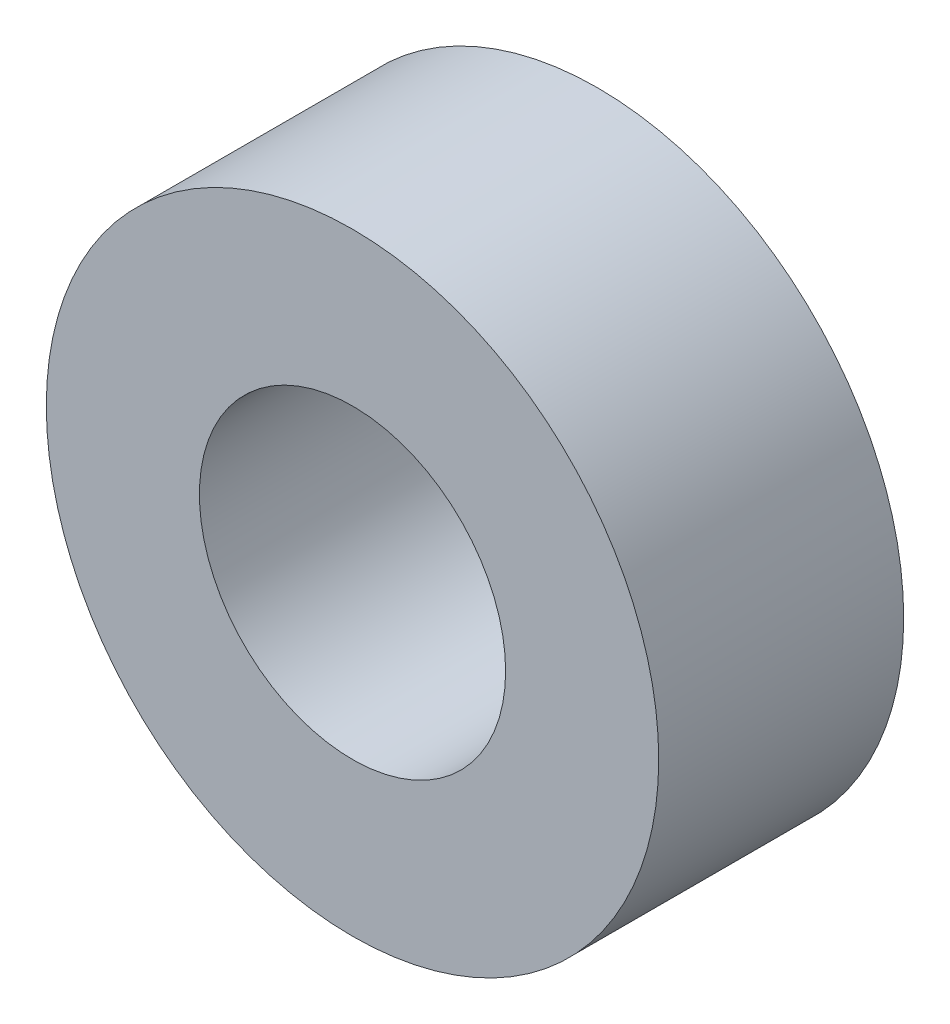
ISO-10303-21;
HEADER;
FILE_DESCRIPTION(('STEP AP214'),'2;1');
FILE_NAME('part.step','',(''),(''),'','','');
FILE_SCHEMA(('AUTOMOTIVE_DESIGN { 1 0 10303 214 1 1 1 1 }'));
ENDSEC;
DATA;
#1=APPLICATION_CONTEXT('core data for automotive mechanical design processes');
#2=APPLICATION_PROTOCOL_DEFINITION('international standard','automotive_design',2000,#1);
#3=PRODUCT_CONTEXT('',#1,'mechanical');
#4=PRODUCT('Part','Part','',(#3));
#5=PRODUCT_RELATED_PRODUCT_CATEGORY('part','',(#4));
#6=PRODUCT_DEFINITION_FORMATION('','',#4);
#7=PRODUCT_DEFINITION_CONTEXT('part definition',#1,'design');
#8=PRODUCT_DEFINITION('design','',#6,#7);
#9=PRODUCT_DEFINITION_SHAPE('','',#8);
#10=(LENGTH_UNIT() NAMED_UNIT(*) SI_UNIT(.MILLI.,.METRE.));
#11=(NAMED_UNIT(*) PLANE_ANGLE_UNIT() SI_UNIT($,.RADIAN.));
#12=(NAMED_UNIT(*) SI_UNIT($,.STERADIAN.) SOLID_ANGLE_UNIT());
#13=UNCERTAINTY_MEASURE_WITH_UNIT(LENGTH_MEASURE(1.E-05),#10,'distance_accuracy_value','');
#14=(GEOMETRIC_REPRESENTATION_CONTEXT(3) GLOBAL_UNCERTAINTY_ASSIGNED_CONTEXT((#13)) GLOBAL_UNIT_ASSIGNED_CONTEXT((#10,
#11,#12)) REPRESENTATION_CONTEXT('',''));
#15=CARTESIAN_POINT('',(0.,0.,0.));
#16=DIRECTION('',(0.,0.,1.));
#17=DIRECTION('',(1.,0.,0.));
#18=AXIS2_PLACEMENT_3D('',#15,#16,#17);
#19=CARTESIAN_POINT('',(0.,0.,0.));
#20=DIRECTION('',(0.,0.,1.));
#21=DIRECTION('',(1.,0.,0.));
#22=AXIS2_PLACEMENT_3D('',#19,#20,#21);
#23=PLANE('',#22);
#24=CARTESIAN_POINT('',(0.,0.,0.));
#25=DIRECTION('',(0.,0.,1.));
#26=DIRECTION('',(1.,0.,0.));
#27=AXIS2_PLACEMENT_3D('',#24,#25,#26);
#28=CIRCLE('',#27,2.5);
#29=CARTESIAN_POINT('',(2.5,0.,0.));
#30=VERTEX_POINT('',#29);
#31=EDGE_CURVE('E40',#30,#30,#28,.T.);
#32=ORIENTED_EDGE('',*,*,#31,.T.);
#33=EDGE_LOOP('',(#32));
#34=FACE_BOUND('',#33,.T.);
#35=CARTESIAN_POINT('',(0.,0.,0.));
#36=DIRECTION('',(0.,0.,1.));
#37=DIRECTION('',(1.,0.,0.));
#38=AXIS2_PLACEMENT_3D('',#35,#36,#37);
#39=CIRCLE('',#38,5.);
#40=CARTESIAN_POINT('',(5.,0.,0.));
#41=VERTEX_POINT('',#40);
#42=EDGE_CURVE('E36',#41,#41,#39,.T.);
#43=ORIENTED_EDGE('',*,*,#42,.F.);
#44=EDGE_LOOP('',(#43));
#45=FACE_BOUND('',#44,.T.);
#46=ADVANCED_FACE('F33',(#34,#45),#23,.F.);
#47=CARTESIAN_POINT('',(0.,0.,4.));
#48=DIRECTION('',(0.,0.,-1.));
#49=DIRECTION('',(-1.,0.,0.));
#50=AXIS2_PLACEMENT_3D('',#47,#48,#49);
#51=CYLINDRICAL_SURFACE('',#50,5.);
#52=CARTESIAN_POINT('',(0.,0.,4.));
#53=DIRECTION('',(0.,0.,1.));
#54=DIRECTION('',(1.,0.,0.));
#55=AXIS2_PLACEMENT_3D('',#52,#53,#54);
#56=CIRCLE('',#55,5.);
#57=CARTESIAN_POINT('',(5.,0.,4.));
#58=VERTEX_POINT('',#57);
#59=EDGE_CURVE('E10',#58,#58,#56,.T.);
#60=ORIENTED_EDGE('',*,*,#59,.F.);
#61=EDGE_LOOP('',(#60));
#62=FACE_BOUND('',#61,.T.);
#63=ORIENTED_EDGE('',*,*,#42,.T.);
#64=EDGE_LOOP('',(#63));
#65=FACE_BOUND('',#64,.T.);
#66=ADVANCED_FACE('F53',(#62,#65),#51,.T.);
#67=CARTESIAN_POINT('',(0.,0.,4.));
#68=DIRECTION('',(0.,0.,1.));
#69=DIRECTION('',(1.,0.,0.));
#70=AXIS2_PLACEMENT_3D('',#67,#68,#69);
#71=PLANE('',#70);
#72=CARTESIAN_POINT('',(0.,0.,4.));
#73=DIRECTION('',(0.,0.,1.));
#74=DIRECTION('',(1.,0.,0.));
#75=AXIS2_PLACEMENT_3D('',#72,#73,#74);
#76=CIRCLE('',#75,2.5);
#77=CARTESIAN_POINT('',(2.5,0.,4.));
#78=VERTEX_POINT('',#77);
#79=EDGE_CURVE('E44',#78,#78,#76,.T.);
#80=ORIENTED_EDGE('',*,*,#79,.F.);
#81=EDGE_LOOP('',(#80));
#82=FACE_BOUND('',#81,.T.);
#83=ORIENTED_EDGE('',*,*,#59,.T.);
#84=EDGE_LOOP('',(#83));
#85=FACE_BOUND('',#84,.T.);
#86=ADVANCED_FACE('F62',(#82,#85),#71,.T.);
#87=CARTESIAN_POINT('',(0.,0.,-3.));
#88=DIRECTION('',(0.,0.,1.));
#89=DIRECTION('',(1.,0.,0.));
#90=AXIS2_PLACEMENT_3D('',#87,#88,#89);
#91=CYLINDRICAL_SURFACE('',#90,2.5);
#92=ORIENTED_EDGE('',*,*,#79,.T.);
#93=EDGE_LOOP('',(#92));
#94=FACE_BOUND('',#93,.T.);
#95=ORIENTED_EDGE('',*,*,#31,.F.);
#96=EDGE_LOOP('',(#95));
#97=FACE_BOUND('',#96,.T.);
#98=ADVANCED_FACE('F66',(#94,#97),#91,.F.);
#99=CLOSED_SHELL('',(#46,#66,#86,#98));
#100=MANIFOLD_SOLID_BREP('B2',#99);
#101=ADVANCED_BREP_SHAPE_REPRESENTATION('',(#18,#100),#14);
#102=SHAPE_DEFINITION_REPRESENTATION(#9,#101);
ENDSEC;
END-ISO-10303-21;
